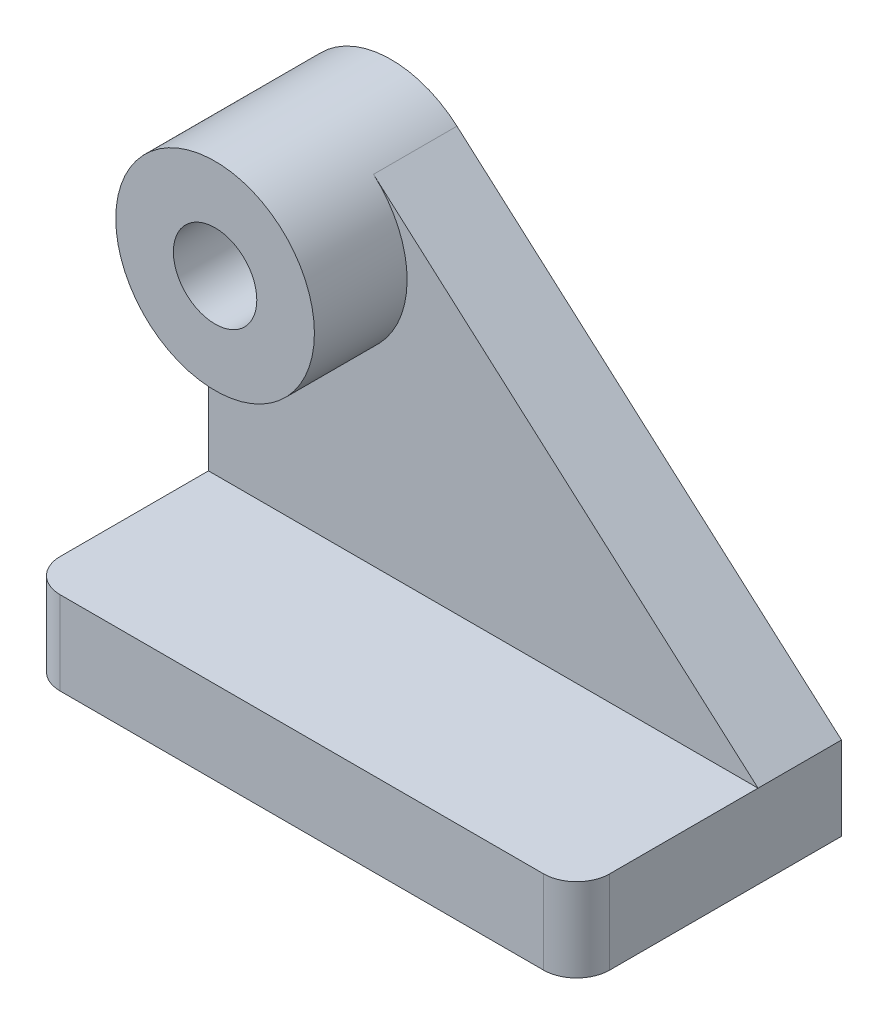
ISO-10303-21;
HEADER;
FILE_DESCRIPTION(('STEP AP214'),'2;1');
FILE_NAME('part.step','',(''),(''),'','','');
FILE_SCHEMA(('AUTOMOTIVE_DESIGN { 1 0 10303 214 1 1 1 1 }'));
ENDSEC;
DATA;
#1=APPLICATION_CONTEXT('core data for automotive mechanical design processes');
#2=APPLICATION_PROTOCOL_DEFINITION('international standard','automotive_design',2000,#1);
#3=PRODUCT_CONTEXT('',#1,'mechanical');
#4=PRODUCT('Part','Part','',(#3));
#5=PRODUCT_RELATED_PRODUCT_CATEGORY('part','',(#4));
#6=PRODUCT_DEFINITION_FORMATION('','',#4);
#7=PRODUCT_DEFINITION_CONTEXT('part definition',#1,'design');
#8=PRODUCT_DEFINITION('design','',#6,#7);
#9=PRODUCT_DEFINITION_SHAPE('','',#8);
#10=(LENGTH_UNIT() NAMED_UNIT(*) SI_UNIT(.MILLI.,.METRE.));
#11=(NAMED_UNIT(*) PLANE_ANGLE_UNIT() SI_UNIT($,.RADIAN.));
#12=(NAMED_UNIT(*) SI_UNIT($,.STERADIAN.) SOLID_ANGLE_UNIT());
#13=UNCERTAINTY_MEASURE_WITH_UNIT(LENGTH_MEASURE(1.E-05),#10,'distance_accuracy_value','');
#14=(GEOMETRIC_REPRESENTATION_CONTEXT(3) GLOBAL_UNCERTAINTY_ASSIGNED_CONTEXT((#13)) GLOBAL_UNIT_ASSIGNED_CONTEXT((#10,
#11,#12)) REPRESENTATION_CONTEXT('',''));
#15=CARTESIAN_POINT('',(0.,0.,0.));
#16=DIRECTION('',(0.,0.,1.));
#17=DIRECTION('',(1.,0.,0.));
#18=AXIS2_PLACEMENT_3D('',#15,#16,#17);
#19=CARTESIAN_POINT('',(-2.01076716016151,0.63,-1.12267833109018));
#20=DIRECTION('',(1.,0.,0.));
#21=DIRECTION('',(0.,0.,-1.));
#22=AXIS2_PLACEMENT_3D('',#19,#20,#21);
#23=PLANE('',#22);
#24=DIRECTION('',(0.,0.,1.));
#25=VECTOR('',#24,1.);
#26=CARTESIAN_POINT('',(-2.01076716016151,0.,-1.12267833109018));
#27=LINE('',#26,#25);
#28=CARTESIAN_POINT('',(-2.01076716016151,0.,-1.12267833109018));
#29=VERTEX_POINT('',#28);
#30=CARTESIAN_POINT('',(-2.01076716016151,0.,0.627321668909823));
#31=VERTEX_POINT('',#30);
#32=EDGE_CURVE('E149',#29,#31,#27,.T.);
#33=ORIENTED_EDGE('',*,*,#32,.T.);
#34=DIRECTION('',(0.,-1.,0.));
#35=VECTOR('',#34,1.);
#36=CARTESIAN_POINT('',(-2.01076716016151,0.63,0.627321668909823));
#37=LINE('',#36,#35);
#38=CARTESIAN_POINT('',(-2.01076716016151,0.63,0.627321668909823));
#39=VERTEX_POINT('',#38);
#40=EDGE_CURVE('E11',#39,#31,#37,.T.);
#41=ORIENTED_EDGE('',*,*,#40,.F.);
#42=DIRECTION('',(0.,0.,1.));
#43=VECTOR('',#42,1.);
#44=CARTESIAN_POINT('',(-2.01076716016151,0.63,-1.12267833109018));
#45=LINE('',#44,#43);
#46=CARTESIAN_POINT('',(-2.01076716016151,0.63,-0.492678331090175));
#47=VERTEX_POINT('',#46);
#48=EDGE_CURVE('E98',#47,#39,#45,.T.);
#49=ORIENTED_EDGE('',*,*,#48,.F.);
#50=DIRECTION('',(0.,1.,0.));
#51=VECTOR('',#50,1.);
#52=CARTESIAN_POINT('',(-2.01076716016151,2.63,-0.492678331090175));
#53=LINE('',#52,#51);
#54=CARTESIAN_POINT('',(-2.01076716016151,2.63,-0.492678331090175));
#55=VERTEX_POINT('',#54);
#56=EDGE_CURVE('E55',#47,#55,#53,.T.);
#57=ORIENTED_EDGE('',*,*,#56,.T.);
#58=DIRECTION('',(0.,0.,-1.));
#59=VECTOR('',#58,1.);
#60=CARTESIAN_POINT('',(-2.01076716016151,2.63,-0.492678331090175));
#61=LINE('',#60,#59);
#62=CARTESIAN_POINT('',(-2.01076716016151,2.63,-1.12267833109018));
#63=VERTEX_POINT('',#62);
#64=EDGE_CURVE('E124',#55,#63,#61,.T.);
#65=ORIENTED_EDGE('',*,*,#64,.T.);
#66=DIRECTION('',(0.,-1.,0.));
#67=VECTOR('',#66,1.);
#68=CARTESIAN_POINT('',(-2.01076716016151,0.63,-1.12267833109018));
#69=LINE('',#68,#67);
#70=EDGE_CURVE('E159',#63,#29,#69,.T.);
#71=ORIENTED_EDGE('',*,*,#70,.T.);
#72=EDGE_LOOP('',(#33,#41,#49,#57,#65,#71));
#73=FACE_BOUND('',#72,.T.);
#74=ADVANCED_FACE('F41',(#73),#23,.F.);
#75=CARTESIAN_POINT('',(-1.76076716016151,0.63,0.627321668909825));
#76=DIRECTION('',(0.,-1.,0.));
#77=DIRECTION('',(0.,0.,-1.));
#78=AXIS2_PLACEMENT_3D('',#75,#76,#77);
#79=CYLINDRICAL_SURFACE('',#78,0.25);
#80=CARTESIAN_POINT('',(-1.76076716016151,0.,0.627321668909825));
#81=DIRECTION('',(0.,1.,0.));
#82=DIRECTION('',(0.,0.,-1.));
#83=AXIS2_PLACEMENT_3D('',#80,#81,#82);
#84=CIRCLE('',#83,0.25);
#85=CARTESIAN_POINT('',(-1.76076716016151,0.,0.877321668909825));
#86=VERTEX_POINT('',#85);
#87=EDGE_CURVE('E162',#31,#86,#84,.T.);
#88=ORIENTED_EDGE('',*,*,#87,.T.);
#89=DIRECTION('',(0.,-1.,0.));
#90=VECTOR('',#89,1.);
#91=CARTESIAN_POINT('',(-1.76076716016151,0.63,0.877321668909825));
#92=LINE('',#91,#90);
#93=CARTESIAN_POINT('',(-1.76076716016151,0.63,0.877321668909825));
#94=VERTEX_POINT('',#93);
#95=EDGE_CURVE('E48',#94,#86,#92,.T.);
#96=ORIENTED_EDGE('',*,*,#95,.F.);
#97=CARTESIAN_POINT('',(-1.76076716016151,0.63,0.627321668909825));
#98=DIRECTION('',(0.,1.,0.));
#99=DIRECTION('',(0.,0.,-1.));
#100=AXIS2_PLACEMENT_3D('',#97,#98,#99);
#101=CIRCLE('',#100,0.25);
#102=EDGE_CURVE('E152',#39,#94,#101,.T.);
#103=ORIENTED_EDGE('',*,*,#102,.F.);
#104=ORIENTED_EDGE('',*,*,#40,.T.);
#105=EDGE_LOOP('',(#88,#96,#103,#104));
#106=FACE_BOUND('',#105,.T.);
#107=ADVANCED_FACE('F201',(#106),#79,.T.);
#108=CARTESIAN_POINT('',(-1.76076716016151,0.63,0.877321668909825));
#109=DIRECTION('',(0.,0.,-1.));
#110=DIRECTION('',(-1.,0.,0.));
#111=AXIS2_PLACEMENT_3D('',#108,#109,#110);
#112=PLANE('',#111);
#113=DIRECTION('',(1.,0.,0.));
#114=VECTOR('',#113,1.);
#115=CARTESIAN_POINT('',(-1.76076716016151,0.,0.877321668909825));
#116=LINE('',#115,#114);
#117=CARTESIAN_POINT('',(1.88923283983849,0.,0.877321668909825));
#118=VERTEX_POINT('',#117);
#119=EDGE_CURVE('E164',#86,#118,#116,.T.);
#120=ORIENTED_EDGE('',*,*,#119,.T.);
#121=DIRECTION('',(0.,-1.,0.));
#122=VECTOR('',#121,1.);
#123=CARTESIAN_POINT('',(1.88923283983849,0.63,0.877321668909825));
#124=LINE('',#123,#122);
#125=CARTESIAN_POINT('',(1.88923283983849,0.63,0.877321668909825));
#126=VERTEX_POINT('',#125);
#127=EDGE_CURVE('E177',#126,#118,#124,.T.);
#128=ORIENTED_EDGE('',*,*,#127,.F.);
#129=DIRECTION('',(1.,0.,0.));
#130=VECTOR('',#129,1.);
#131=CARTESIAN_POINT('',(-1.76076716016151,0.63,0.877321668909825));
#132=LINE('',#131,#130);
#133=EDGE_CURVE('E154',#94,#126,#132,.T.);
#134=ORIENTED_EDGE('',*,*,#133,.F.);
#135=ORIENTED_EDGE('',*,*,#95,.T.);
#136=EDGE_LOOP('',(#120,#128,#134,#135));
#137=FACE_BOUND('',#136,.T.);
#138=ADVANCED_FACE('F184',(#137),#112,.F.);
#139=CARTESIAN_POINT('',(1.88923283983849,0.63,0.627321668909825));
#140=DIRECTION('',(0.,-1.,0.));
#141=DIRECTION('',(0.,0.,-1.));
#142=AXIS2_PLACEMENT_3D('',#139,#140,#141);
#143=CYLINDRICAL_SURFACE('',#142,0.25);
#144=CARTESIAN_POINT('',(1.88923283983849,0.,0.627321668909825));
#145=DIRECTION('',(0.,1.,0.));
#146=DIRECTION('',(0.,0.,1.));
#147=AXIS2_PLACEMENT_3D('',#144,#145,#146);
#148=CIRCLE('',#147,0.25);
#149=CARTESIAN_POINT('',(2.13923283983849,0.,0.627321668909823));
#150=VERTEX_POINT('',#149);
#151=EDGE_CURVE('E166',#118,#150,#148,.T.);
#152=ORIENTED_EDGE('',*,*,#151,.T.);
#153=DIRECTION('',(0.,-1.,0.));
#154=VECTOR('',#153,1.);
#155=CARTESIAN_POINT('',(2.13923283983849,0.63,0.627321668909823));
#156=LINE('',#155,#154);
#157=CARTESIAN_POINT('',(2.13923283983849,0.63,0.627321668909823));
#158=VERTEX_POINT('',#157);
#159=EDGE_CURVE('E174',#158,#150,#156,.T.);
#160=ORIENTED_EDGE('',*,*,#159,.F.);
#161=CARTESIAN_POINT('',(1.88923283983849,0.63,0.627321668909825));
#162=DIRECTION('',(0.,1.,0.));
#163=DIRECTION('',(0.,0.,1.));
#164=AXIS2_PLACEMENT_3D('',#161,#162,#163);
#165=CIRCLE('',#164,0.25);
#166=EDGE_CURVE('E64',#126,#158,#165,.T.);
#167=ORIENTED_EDGE('',*,*,#166,.F.);
#168=ORIENTED_EDGE('',*,*,#127,.T.);
#169=EDGE_LOOP('',(#152,#160,#167,#168));
#170=FACE_BOUND('',#169,.T.);
#171=ADVANCED_FACE('F193',(#170),#143,.T.);
#172=CARTESIAN_POINT('',(2.13923283983849,0.63,-1.12267833109018));
#173=DIRECTION('',(-1.,0.,0.));
#174=DIRECTION('',(0.,0.,1.));
#175=AXIS2_PLACEMENT_3D('',#172,#173,#174);
#176=PLANE('',#175);
#177=DIRECTION('',(0.,0.,-1.));
#178=VECTOR('',#177,1.);
#179=CARTESIAN_POINT('',(2.13923283983849,0.,-1.12267833109018));
#180=LINE('',#179,#178);
#181=CARTESIAN_POINT('',(2.13923283983849,0.,-1.12267833109018));
#182=VERTEX_POINT('',#181);
#183=EDGE_CURVE('E168',#150,#182,#180,.T.);
#184=ORIENTED_EDGE('',*,*,#183,.T.);
#185=DIRECTION('',(0.,-1.,0.));
#186=VECTOR('',#185,1.);
#187=CARTESIAN_POINT('',(2.13923283983849,0.63,-1.12267833109018));
#188=LINE('',#187,#186);
#189=CARTESIAN_POINT('',(2.13923283983849,0.63,-1.12267833109018));
#190=VERTEX_POINT('',#189);
#191=EDGE_CURVE('E172',#190,#182,#188,.T.);
#192=ORIENTED_EDGE('',*,*,#191,.F.);
#193=DIRECTION('',(0.,0.,-1.));
#194=VECTOR('',#193,1.);
#195=CARTESIAN_POINT('',(2.13923283983849,0.63,-0.492678331090175));
#196=LINE('',#195,#194);
#197=CARTESIAN_POINT('',(2.13923283983849,0.63,-0.492678331090175));
#198=VERTEX_POINT('',#197);
#199=EDGE_CURVE('E136',#198,#190,#196,.T.);
#200=ORIENTED_EDGE('',*,*,#199,.F.);
#201=DIRECTION('',(0.,0.,-1.));
#202=VECTOR('',#201,1.);
#203=CARTESIAN_POINT('',(2.13923283983849,0.63,-1.12267833109018));
#204=LINE('',#203,#202);
#205=EDGE_CURVE('E157',#158,#198,#204,.T.);
#206=ORIENTED_EDGE('',*,*,#205,.F.);
#207=ORIENTED_EDGE('',*,*,#159,.T.);
#208=EDGE_LOOP('',(#184,#192,#200,#206,#207));
#209=FACE_BOUND('',#208,.T.);
#210=ADVANCED_FACE('F196',(#209),#176,.F.);
#211=CARTESIAN_POINT('',(-2.01076716016151,0.63,-1.12267833109018));
#212=DIRECTION('',(0.,0.,1.));
#213=DIRECTION('',(1.,0.,0.));
#214=AXIS2_PLACEMENT_3D('',#211,#212,#213);
#215=PLANE('',#214);
#216=DIRECTION('',(-1.,0.,0.));
#217=VECTOR('',#216,1.);
#218=CARTESIAN_POINT('',(-2.01076716016151,0.,-1.12267833109018));
#219=LINE('',#218,#217);
#220=EDGE_CURVE('E92',#182,#29,#219,.T.);
#221=ORIENTED_EDGE('',*,*,#220,.T.);
#222=ORIENTED_EDGE('',*,*,#70,.F.);
#223=CARTESIAN_POINT('',(-1.26076716016151,2.63,-1.12267833109018));
#224=DIRECTION('',(0.,0.,-1.));
#225=DIRECTION('',(1.,0.,0.));
#226=AXIS2_PLACEMENT_3D('',#223,#224,#225);
#227=CIRCLE('',#226,0.75);
#228=CARTESIAN_POINT('',(-0.764527386625558,3.19235761501111,-1.12267833109018));
#229=VERTEX_POINT('',#228);
#230=EDGE_CURVE('E145',#63,#229,#227,.T.);
#231=ORIENTED_EDGE('',*,*,#230,.T.);
#232=DIRECTION('',(0.749810153348153,-0.661653031381266,0.));
#233=VECTOR('',#232,1.);
#234=CARTESIAN_POINT('',(2.13923283983849,0.63,-1.12267833109018));
#235=LINE('',#234,#233);
#236=EDGE_CURVE('E135',#229,#190,#235,.T.);
#237=ORIENTED_EDGE('',*,*,#236,.T.);
#238=ORIENTED_EDGE('',*,*,#191,.T.);
#239=EDGE_LOOP('',(#221,#222,#231,#237,#238));
#240=FACE_BOUND('',#239,.T.);
#241=CARTESIAN_POINT('',(-1.26076716016151,2.63,-1.12267833109018));
#242=DIRECTION('',(0.,0.,-1.));
#243=DIRECTION('',(-1.,0.,0.));
#244=AXIS2_PLACEMENT_3D('',#241,#242,#243);
#245=CIRCLE('',#244,0.315);
#246=CARTESIAN_POINT('',(-1.57576716016151,2.63,-1.12267833109018));
#247=VERTEX_POINT('',#246);
#248=EDGE_CURVE('E147',#247,#247,#245,.T.);
#249=ORIENTED_EDGE('',*,*,#248,.F.);
#250=EDGE_LOOP('',(#249));
#251=FACE_BOUND('',#250,.T.);
#252=ADVANCED_FACE('F213',(#240,#251),#215,.F.);
#253=CARTESIAN_POINT('',(-1.76076716016151,0.63,0.627321668909825));
#254=DIRECTION('',(0.,-1.,0.));
#255=DIRECTION('',(0.,0.,-1.));
#256=AXIS2_PLACEMENT_3D('',#253,#254,#255);
#257=PLANE('',#256);
#258=ORIENTED_EDGE('',*,*,#205,.T.);
#259=DIRECTION('',(-1.,0.,0.));
#260=VECTOR('',#259,1.);
#261=CARTESIAN_POINT('',(2.13923283983849,0.63,-0.492678331090175));
#262=LINE('',#261,#260);
#263=EDGE_CURVE('E139',#198,#47,#262,.T.);
#264=ORIENTED_EDGE('',*,*,#263,.T.);
#265=ORIENTED_EDGE('',*,*,#48,.T.);
#266=ORIENTED_EDGE('',*,*,#102,.T.);
#267=ORIENTED_EDGE('',*,*,#133,.T.);
#268=ORIENTED_EDGE('',*,*,#166,.T.);
#269=EDGE_LOOP('',(#258,#264,#265,#266,#267,#268));
#270=FACE_BOUND('',#269,.T.);
#271=ADVANCED_FACE('F198',(#270),#257,.F.);
#272=CARTESIAN_POINT('',(-1.76076716016151,0.,0.627321668909825));
#273=DIRECTION('',(0.,-1.,0.));
#274=DIRECTION('',(0.,0.,-1.));
#275=AXIS2_PLACEMENT_3D('',#272,#273,#274);
#276=PLANE('',#275);
#277=ORIENTED_EDGE('',*,*,#32,.F.);
#278=ORIENTED_EDGE('',*,*,#220,.F.);
#279=ORIENTED_EDGE('',*,*,#183,.F.);
#280=ORIENTED_EDGE('',*,*,#151,.F.);
#281=ORIENTED_EDGE('',*,*,#119,.F.);
#282=ORIENTED_EDGE('',*,*,#87,.F.);
#283=EDGE_LOOP('',(#277,#278,#279,#280,#281,#282));
#284=FACE_BOUND('',#283,.T.);
#285=ADVANCED_FACE('F190',(#284),#276,.T.);
#286=CARTESIAN_POINT('',(2.13923283983849,0.63,-0.492678331090175));
#287=DIRECTION('',(0.661653031381266,0.749810153348153,0.));
#288=DIRECTION('',(-0.749810153348153,0.661653031381266,0.));
#289=AXIS2_PLACEMENT_3D('',#286,#287,#288);
#290=PLANE('',#289);
#291=ORIENTED_EDGE('',*,*,#236,.F.);
#292=DIRECTION('',(0.,0.,-1.));
#293=VECTOR('',#292,1.);
#294=CARTESIAN_POINT('',(-0.764527386625558,3.19235761501111,-0.492678331090175));
#295=LINE('',#294,#293);
#296=CARTESIAN_POINT('',(-0.764527386625558,3.19235761501111,-0.492678331090175));
#297=VERTEX_POINT('',#296);
#298=EDGE_CURVE('E121',#297,#229,#295,.T.);
#299=ORIENTED_EDGE('',*,*,#298,.F.);
#300=DIRECTION('',(0.749810153348153,-0.661653031381266,0.));
#301=VECTOR('',#300,1.);
#302=CARTESIAN_POINT('',(2.13923283983849,0.63,-0.492678331090175));
#303=LINE('',#302,#301);
#304=EDGE_CURVE('E132',#297,#198,#303,.T.);
#305=ORIENTED_EDGE('',*,*,#304,.T.);
#306=ORIENTED_EDGE('',*,*,#199,.T.);
#307=EDGE_LOOP('',(#291,#299,#305,#306));
#308=FACE_BOUND('',#307,.T.);
#309=ADVANCED_FACE('F131',(#308),#290,.T.);
#310=CARTESIAN_POINT('',(-1.26076716016151,2.63,-0.492678331090175));
#311=DIRECTION('',(0.,0.,-1.));
#312=DIRECTION('',(-1.,0.,0.));
#313=AXIS2_PLACEMENT_3D('',#310,#311,#312);
#314=CYLINDRICAL_SURFACE('',#313,0.75);
#315=ORIENTED_EDGE('',*,*,#230,.F.);
#316=ORIENTED_EDGE('',*,*,#64,.F.);
#317=CARTESIAN_POINT('',(-1.26076716016151,2.63,-0.492678331090175));
#318=DIRECTION('',(0.,0.,1.));
#319=DIRECTION('',(1.,0.,0.));
#320=AXIS2_PLACEMENT_3D('',#317,#318,#319);
#321=CIRCLE('',#320,0.75);
#322=EDGE_CURVE('E116',#55,#297,#321,.T.);
#323=ORIENTED_EDGE('',*,*,#322,.T.);
#324=ORIENTED_EDGE('',*,*,#298,.T.);
#325=EDGE_LOOP('',(#315,#316,#323,#324));
#326=FACE_BOUND('',#325,.T.);
#327=CARTESIAN_POINT('',(-1.26076716016151,2.63,0.207321668909825));
#328=DIRECTION('',(0.,0.,1.));
#329=DIRECTION('',(1.,0.,0.));
#330=AXIS2_PLACEMENT_3D('',#327,#328,#329);
#331=CIRCLE('',#330,0.75);
#332=CARTESIAN_POINT('',(-0.510767160161508,2.63,0.207321668909825));
#333=VERTEX_POINT('',#332);
#334=EDGE_CURVE('E240',#333,#333,#331,.T.);
#335=ORIENTED_EDGE('',*,*,#334,.F.);
#336=EDGE_LOOP('',(#335));
#337=FACE_BOUND('',#336,.T.);
#338=ADVANCED_FACE('F119',(#326,#337),#314,.T.);
#339=CARTESIAN_POINT('',(-1.26076716016151,2.63,-0.492678331090175));
#340=DIRECTION('',(0.,0.,1.));
#341=DIRECTION('',(1.,0.,0.));
#342=AXIS2_PLACEMENT_3D('',#339,#340,#341);
#343=PLANE('',#342);
#344=ORIENTED_EDGE('',*,*,#304,.F.);
#345=ORIENTED_EDGE('',*,*,#322,.F.);
#346=ORIENTED_EDGE('',*,*,#56,.F.);
#347=ORIENTED_EDGE('',*,*,#263,.F.);
#348=EDGE_LOOP('',(#344,#345,#346,#347));
#349=FACE_BOUND('',#348,.T.);
#350=ADVANCED_FACE('F138',(#349),#343,.T.);
#351=CARTESIAN_POINT('',(-1.26076716016151,2.63,-0.492678331090175));
#352=DIRECTION('',(0.,0.,-1.));
#353=DIRECTION('',(-1.,0.,0.));
#354=AXIS2_PLACEMENT_3D('',#351,#352,#353);
#355=CYLINDRICAL_SURFACE('',#354,0.315);
#356=ORIENTED_EDGE('',*,*,#248,.T.);
#357=EDGE_LOOP('',(#356));
#358=FACE_BOUND('',#357,.T.);
#359=CARTESIAN_POINT('',(-1.26076716016151,2.63,0.207321668909825));
#360=DIRECTION('',(0.,0.,1.));
#361=DIRECTION('',(1.,0.,0.));
#362=AXIS2_PLACEMENT_3D('',#359,#360,#361);
#363=CIRCLE('',#362,0.315);
#364=CARTESIAN_POINT('',(-0.945767160161508,2.63,0.207321668909825));
#365=VERTEX_POINT('',#364);
#366=EDGE_CURVE('E126',#365,#365,#363,.F.);
#367=ORIENTED_EDGE('',*,*,#366,.F.);
#368=EDGE_LOOP('',(#367));
#369=FACE_BOUND('',#368,.T.);
#370=ADVANCED_FACE('F226',(#358,#369),#355,.F.);
#371=CARTESIAN_POINT('',(0.,0.,0.207321668909825));
#372=DIRECTION('',(0.,0.,1.));
#373=DIRECTION('',(1.,0.,0.));
#374=AXIS2_PLACEMENT_3D('',#371,#372,#373);
#375=PLANE('',#374);
#376=ORIENTED_EDGE('',*,*,#366,.T.);
#377=EDGE_LOOP('',(#376));
#378=FACE_BOUND('',#377,.T.);
#379=ORIENTED_EDGE('',*,*,#334,.T.);
#380=EDGE_LOOP('',(#379));
#381=FACE_BOUND('',#380,.T.);
#382=ADVANCED_FACE('F229',(#378,#381),#375,.T.);
#383=CLOSED_SHELL('',(#74,#107,#138,#171,#210,#252,#271,#285,#309,#338,#350,#370,#382));
#384=MANIFOLD_SOLID_BREP('B2',#383);
#385=ADVANCED_BREP_SHAPE_REPRESENTATION('',(#18,#384),#14);
#386=SHAPE_DEFINITION_REPRESENTATION(#9,#385);
ENDSEC;
END-ISO-10303-21;
